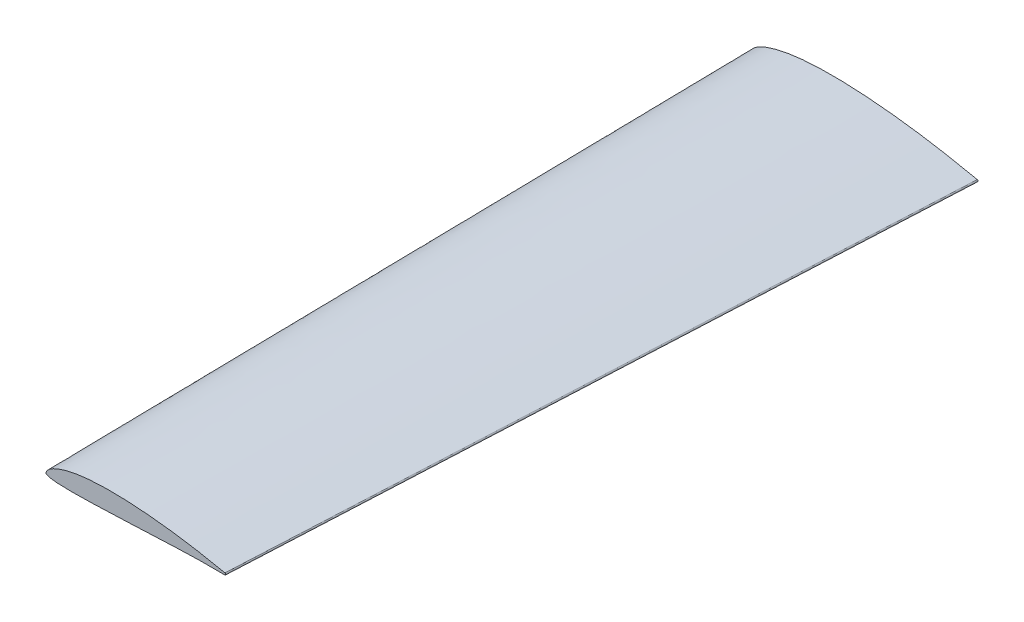
ISO-10303-21;
HEADER;
FILE_DESCRIPTION(('STEP AP214'),'2;1');
FILE_NAME('part.step','',(''),(''),'','','');
FILE_SCHEMA(('AUTOMOTIVE_DESIGN { 1 0 10303 214 1 1 1 1 }'));
ENDSEC;
DATA;
#1=APPLICATION_CONTEXT('core data for automotive mechanical design processes');
#2=APPLICATION_PROTOCOL_DEFINITION('international standard','automotive_design',2000,#1);
#3=PRODUCT_CONTEXT('',#1,'mechanical');
#4=PRODUCT('Part','Part','',(#3));
#5=PRODUCT_RELATED_PRODUCT_CATEGORY('part','',(#4));
#6=PRODUCT_DEFINITION_FORMATION('','',#4);
#7=PRODUCT_DEFINITION_CONTEXT('part definition',#1,'design');
#8=PRODUCT_DEFINITION('design','',#6,#7);
#9=PRODUCT_DEFINITION_SHAPE('','',#8);
#10=(LENGTH_UNIT() NAMED_UNIT(*) SI_UNIT(.MILLI.,.METRE.));
#11=(NAMED_UNIT(*) PLANE_ANGLE_UNIT() SI_UNIT($,.RADIAN.));
#12=(NAMED_UNIT(*) SI_UNIT($,.STERADIAN.) SOLID_ANGLE_UNIT());
#13=UNCERTAINTY_MEASURE_WITH_UNIT(LENGTH_MEASURE(1.E-05),#10,'distance_accuracy_value','');
#14=(GEOMETRIC_REPRESENTATION_CONTEXT(3) GLOBAL_UNCERTAINTY_ASSIGNED_CONTEXT((#13)) GLOBAL_UNIT_ASSIGNED_CONTEXT((#10,
#11,#12)) REPRESENTATION_CONTEXT('',''));
#15=CARTESIAN_POINT('',(0.,0.,0.));
#16=DIRECTION('',(0.,0.,1.));
#17=DIRECTION('',(1.,0.,0.));
#18=AXIS2_PLACEMENT_3D('',#15,#16,#17);
#19=CARTESIAN_POINT('',(13.4517460063052,2.2360292141561,740.));
#20=DIRECTION('',(0.,0.,1.));
#21=DIRECTION('',(1.,0.,0.));
#22=AXIS2_PLACEMENT_3D('',#19,#20,#21);
#23=PLANE('',#22);
#24=CARTESIAN_POINT('',(197.291595349815,2.86793277946552,740.));
#25=CARTESIAN_POINT('',(195.312079724609,3.27334955577674,740.));
#26=CARTESIAN_POINT('',(191.074144591571,4.14627716334438,740.));
#27=CARTESIAN_POINT('',(184.318478618436,5.51626997247974,740.));
#28=CARTESIAN_POINT('',(176.837510223753,6.97176864434472,740.));
#29=CARTESIAN_POINT('',(168.752566914659,8.44637887681676,740.));
#30=CARTESIAN_POINT('',(160.147793554918,9.89426193294475,740.));
#31=CARTESIAN_POINT('',(151.105981215813,11.2786216238562,740.));
#32=CARTESIAN_POINT('',(141.718962801258,12.5746341173652,740.));
#33=CARTESIAN_POINT('',(132.082268781343,13.7529127900567,740.));
#34=CARTESIAN_POINT('',(122.295761881316,14.7919564135995,740.));
#35=CARTESIAN_POINT('',(112.458756480771,15.6615781652495,740.));
#36=CARTESIAN_POINT('',(102.670664042973,16.3387879453908,740.));
#37=CARTESIAN_POINT('',(93.0280749944796,16.8041132858275,740.));
#38=CARTESIAN_POINT('',(83.6221091385133,17.0383550287883,740.));
#39=CARTESIAN_POINT('',(74.5400080228458,17.0313313584405,740.));
#40=CARTESIAN_POINT('',(65.8641711325625,16.7717363131863,740.));
#41=CARTESIAN_POINT('',(57.6703172483418,16.2564676927047,740.));
#42=CARTESIAN_POINT('',(50.0236676445992,15.4847749300983,740.));
#43=CARTESIAN_POINT('',(42.9821543791823,14.4513259051911,740.));
#44=CARTESIAN_POINT('',(36.5929817590931,13.2019314567816,740.));
#45=CARTESIAN_POINT('',(30.8984099214197,11.7419931500888,740.));
#46=CARTESIAN_POINT('',(25.93615424469,10.0880791762876,740.));
#47=CARTESIAN_POINT('',(21.7230729086209,8.31360903600298,740.));
#48=CARTESIAN_POINT('',(18.2789002988487,6.46559766044276,740.));
#49=CARTESIAN_POINT('',(15.62819772296,4.62389921968104,740.));
#50=CARTESIAN_POINT('',(13.7592710907508,2.78465935760903,740.));
#51=CARTESIAN_POINT('',(12.7413729914095,1.1678335658997,740.));
#52=CARTESIAN_POINT('',(12.3072927928413,-0.549235551179624,740.));
#53=CARTESIAN_POINT('',(13.8612768515086,-1.69864203566333,740.));
#54=CARTESIAN_POINT('',(16.101807562113,-2.27520943388668,740.));
#55=CARTESIAN_POINT('',(19.4492611671672,-2.91777390324169,740.));
#56=CARTESIAN_POINT('',(23.8087875319364,-3.32636967555989,740.));
#57=CARTESIAN_POINT('',(29.1783989314235,-3.61916373660292,740.));
#58=CARTESIAN_POINT('',(35.5023561922327,-3.7507043040599,740.));
#59=CARTESIAN_POINT('',(42.7238269652506,-3.75126757238169,740.));
#60=CARTESIAN_POINT('',(50.7702678647919,-3.6304211165848,740.));
#61=CARTESIAN_POINT('',(59.5562442179012,-3.40154041694244,740.));
#62=CARTESIAN_POINT('',(68.9854342669128,-3.09488549846827,740.));
#63=CARTESIAN_POINT('',(78.9480811467622,-2.72722728644086,740.));
#64=CARTESIAN_POINT('',(89.3285085947018,-2.30347692773391,740.));
#65=CARTESIAN_POINT('',(100.00979181249,-1.8451067250394,740.));
#66=CARTESIAN_POINT('',(110.872783341423,-1.35588828422285,740.));
#67=CARTESIAN_POINT('',(121.797709464549,-0.858911186436468,740.));
#68=CARTESIAN_POINT('',(132.659294998299,-0.37673803821542,740.));
#69=CARTESIAN_POINT('',(143.329256663084,0.0612424511785985,740.));
#70=CARTESIAN_POINT('',(153.676942484987,0.453434481292482,740.));
#71=CARTESIAN_POINT('',(163.572760876274,0.766125592478284,740.));
#72=CARTESIAN_POINT('',(172.88752896712,0.98246672953275,740.));
#73=CARTESIAN_POINT('',(181.486359534792,1.08670782635015,740.));
#74=CARTESIAN_POINT('',(189.245531160731,1.07766316980782,740.));
#75=CARTESIAN_POINT('',(194.316954018626,0.97904099962605,740.));
#76=CARTESIAN_POINT('',(196.811210155025,0.903211349424589,740.));
#77=CARTESIAN_POINT('',(197.024916702042,0.896515167352307,740.));
#78=B_SPLINE_CURVE_WITH_KNOTS('',3,(#24,#25,#26,#27,#28,#29,#30,#31,#32,#33,#34,#35,#36,#37,#38,
#39,#40,#41,#42,#43,#44,#45,#46,#47,#48,#49,#50,#51,#52,#53,#54,#55,#56,#57,#58,#59,#60,#61,#62,
#63,#64,#65,#66,#67,#68,#69,#70,#71,#72,#73,#74,#75,#76,#77),.UNSPECIFIED.,.F.,.F.,(4,1,1,1,1,1,
1,1,1,1,1,1,1,1,1,1,1,1,1,1,1,1,1,1,1,1,1,1,1,1,1,1,1,1,1,1,1,1,1,1,1,1,1,1,1,1,1,1,1,1,1,4),
(0.0380283592532992,0.0528763216078135,0.0699963828754541,0.0888022218683958,0.109061098247873,
0.130567425061989,0.153116971173523,0.176480775419818,0.200411415680187,0.22467357352927,
0.249017674403552,0.273197099739573,0.296987794138895,0.320168615199728,0.342541608750088,
0.363922282890659,0.384135181751947,0.403044445551104,0.42055410189389,0.436574577540293,
0.451009032189176,0.463855249744138,0.47509187234383,0.484672624467163,0.492592722285496,
0.49887863981433,0.503680966723728,0.506999829484217,0.510377645818406,0.516186564755205,
0.52448436696778,0.535271809634217,0.548506368525426,0.564092689522407,0.581895750586396,
0.601730211376006,0.623407354724284,0.646676813485776,0.671267833399773,0.696890216729438,
0.723252935121691,0.750070310983007,0.777040747125043,0.803862160527172,0.830208088720891,
0.855753570413101,0.880187506036329,0.90318552328119,0.924424801622873,0.943584131987353,
0.960334021796242,0.961903264898922),.UNSPECIFIED.);
#79=CARTESIAN_POINT('',(197.291595349815,2.86793277946552,740.));
#80=VERTEX_POINT('',#79);
#81=CARTESIAN_POINT('',(197.024916702042,0.89651516735231,740.));
#82=VERTEX_POINT('',#81);
#83=EDGE_CURVE('E132',#80,#82,#78,.T.);
#84=ORIENTED_EDGE('',*,*,#83,.T.);
#85=CARTESIAN_POINT('',(197.056234870489,1.89602463320301,740.));
#86=DIRECTION('',(0.,0.,-1.));
#87=DIRECTION('',(-1.,0.,0.));
#88=AXIS2_PLACEMENT_3D('',#85,#86,#87);
#89=CIRCLE('',#88,0.999999999999998);
#90=EDGE_CURVE('E13',#80,#82,#89,.T.);
#91=ORIENTED_EDGE('',*,*,#90,.F.);
#92=EDGE_LOOP('',(#84,#91));
#93=FACE_BOUND('',#92,.T.);
#94=ADVANCED_FACE('F122',(#93),#23,.T.);
#95=CARTESIAN_POINT('',(233.846004199116,1.9809981067497,0.));
#96=DIRECTION('',(0.,0.,-1.));
#97=DIRECTION('',(-1.,0.,0.));
#98=AXIS2_PLACEMENT_3D('',#95,#96,#97);
#99=PLANE('',#98);
#100=CARTESIAN_POINT('',(122.5,8.27788481283642,0.));
#101=DIRECTION('',(0.,0.,-1.));
#102=DIRECTION('',(-1.,0.,0.));
#103=AXIS2_PLACEMENT_3D('',#100,#101,#102);
#104=CIRCLE('',#103,4.);
#105=CARTESIAN_POINT('',(118.5,8.27788481283642,0.));
#106=VERTEX_POINT('',#105);
#107=EDGE_CURVE('E330',#106,#106,#104,.F.);
#108=ORIENTED_EDGE('',*,*,#107,.T.);
#109=EDGE_LOOP('',(#108));
#110=FACE_BOUND('',#109,.T.);
#111=CARTESIAN_POINT('',(62.5,8.27788481283643,0.));
#112=DIRECTION('',(0.,0.,-1.));
#113=DIRECTION('',(-1.,0.,0.));
#114=AXIS2_PLACEMENT_3D('',#111,#112,#113);
#115=CIRCLE('',#114,6.00000000000001);
#116=CARTESIAN_POINT('',(56.5,8.27788481283643,0.));
#117=VERTEX_POINT('',#116);
#118=EDGE_CURVE('E168',#117,#117,#115,.F.);
#119=ORIENTED_EDGE('',*,*,#118,.T.);
#120=EDGE_LOOP('',(#119));
#121=FACE_BOUND('',#120,.T.);
#122=CARTESIAN_POINT('',(233.846004199116,1.9809981067497,0.));
#123=DIRECTION('',(0.,0.,-1.));
#124=DIRECTION('',(-1.,0.,0.));
#125=AXIS2_PLACEMENT_3D('',#122,#123,#124);
#126=CIRCLE('',#125,1.);
#127=CARTESIAN_POINT('',(234.045372190915,2.96092279969609,0.));
#128=VERTEX_POINT('',#127);
#129=CARTESIAN_POINT('',(234.045372190915,1.0010734138033,0.));
#130=VERTEX_POINT('',#129);
#131=EDGE_CURVE('E156',#128,#130,#126,.T.);
#132=ORIENTED_EDGE('',*,*,#131,.T.);
#133=CARTESIAN_POINT('',(234.045372190915,2.96092279969609,0.));
#134=CARTESIAN_POINT('',(233.084471371881,3.15642034075415,0.));
#135=CARTESIAN_POINT('',(229.58356297286,3.87157090827319,0.));
#136=CARTESIAN_POINT('',(223.274395629888,5.17134515425177,0.));
#137=CARTESIAN_POINT('',(214.773098276905,6.89533747824343,0.));
#138=CARTESIAN_POINT('',(205.421887784745,8.71471082420948,0.));
#139=CARTESIAN_POINT('',(195.315708649586,10.5579736214296,0.));
#140=CARTESIAN_POINT('',(184.559741951098,12.367827448646,0.));
#141=CARTESIAN_POINT('',(173.257476528351,14.0982770697002,0.));
#142=CARTESIAN_POINT('',(161.523703511221,15.7182926942843,0.));
#143=CARTESIAN_POINT('',(149.477835987293,17.1911410430512,0.));
#144=CARTESIAN_POINT('',(137.244702363111,18.4899455805053,0.));
#145=CARTESIAN_POINT('',(124.948445613144,19.5769727781346,0.));
#146=CARTESIAN_POINT('',(112.713330066451,20.4234850113381,0.));
#147=CARTESIAN_POINT('',(100.660093756216,21.0051416947914,0.));
#148=CARTESIAN_POINT('',(88.9026364364503,21.2979438812058,0.));
#149=CARTESIAN_POINT('',(77.5500100418601,21.2891643007189,0.));
#150=CARTESIAN_POINT('',(66.7052139287931,20.9646705012658,0.));
#151=CARTESIAN_POINT('',(56.4628965730948,20.3205847323833,0.));
#152=CARTESIAN_POINT('',(46.9045845677836,19.3559687853959,0.));
#153=CARTESIAN_POINT('',(38.102692985165,18.0641575100364,0.));
#154=CARTESIAN_POINT('',(30.1162272090289,16.5024144547639,0.));
#155=CARTESIAN_POINT('',(22.9980124107399,14.6774915760678,0.));
#156=CARTESIAN_POINT('',(16.7951928134715,12.6100991128857,0.));
#157=CARTESIAN_POINT('',(11.5288411419299,10.3920114409848,0.));
#158=CARTESIAN_POINT('',(7.22362537819931,8.08199722435898,0.));
#159=CARTESIAN_POINT('',(3.91024715682811,5.77987417558057,0.));
#160=CARTESIAN_POINT('',(1.57408886505825,3.48082434952316,0.));
#161=CARTESIAN_POINT('',(0.301716239555787,1.45979211072129,0.));
#162=CARTESIAN_POINT('',(-0.240884010062589,-0.686544285271975,0.));
#163=CARTESIAN_POINT('',(1.70159606232904,-2.12330239215092,0.));
#164=CARTESIAN_POINT('',(4.50225945011166,-2.84401164176749,0.));
#165=CARTESIAN_POINT('',(8.68657645590246,-3.64721723120633,0.));
#166=CARTESIAN_POINT('',(14.1359844115289,-4.15796195017915,0.));
#167=CARTESIAN_POINT('',(20.8479986606477,-4.52395453088632,0.));
#168=CARTESIAN_POINT('',(28.7529452365513,-4.68838024539354,0.));
#169=CARTESIAN_POINT('',(37.7797837028233,-4.68908433671779,0.));
#170=CARTESIAN_POINT('',(47.8378348273489,-4.53802627357021,0.));
#171=CARTESIAN_POINT('',(58.8203052689232,-4.25192540622226,0.));
#172=CARTESIAN_POINT('',(70.6067928304393,-3.86860676586201,0.));
#173=CARTESIAN_POINT('',(83.0601014305525,-3.40903400899768,0.));
#174=CARTESIAN_POINT('',(96.0356357408246,-2.87934606912652,0.));
#175=CARTESIAN_POINT('',(109.387239763436,-2.30638332451764,0.));
#176=CARTESIAN_POINT('',(122.965979175003,-1.69486028240521,0.));
#177=CARTESIAN_POINT('',(136.622136829319,-1.07363891913129,0.));
#178=CARTESIAN_POINT('',(150.199118746901,-0.470922492762087,0.));
#179=CARTESIAN_POINT('',(163.536570828241,0.0765531102304625,0.));
#180=CARTESIAN_POINT('',(176.471178105942,0.566793139387138,0.));
#181=CARTESIAN_POINT('',(188.840951095307,0.957657020254261,0.));
#182=CARTESIAN_POINT('',(200.484411209042,1.22808343393371,0.));
#183=CARTESIAN_POINT('',(211.232949418717,1.35838479790393,0.));
#184=CARTESIAN_POINT('',(220.931913951134,1.34707897086306,0.));
#185=CARTESIAN_POINT('',(228.394859291241,1.20194970224318,0.));
#186=CARTESIAN_POINT('',(232.652829322058,1.05572626400647,0.));
#187=CARTESIAN_POINT('',(234.045372190915,1.0010734138033,0.));
#188=B_SPLINE_CURVE_WITH_KNOTS('',3,(#133,#134,#135,#136,#137,#138,#139,#140,#141,#142,#143,
#144,#145,#146,#147,#148,#149,#150,#151,#152,#153,#154,#155,#156,#157,#158,#159,#160,#161,#162,
#163,#164,#165,#166,#167,#168,#169,#170,#171,#172,#173,#174,#175,#176,#177,#178,#179,#180,#181,
#182,#183,#184,#185,#186,#187),.UNSPECIFIED.,.F.,.F.,(4,1,1,1,1,1,1,1,1,1,1,1,1,1,1,1,1,1,1,1,1,
1,1,1,1,1,1,1,1,1,1,1,1,1,1,1,1,1,1,1,1,1,1,1,1,1,1,1,1,1,1,1,4),(0.0319213311266676,
0.0376873555473671,0.0528763216078136,0.0699963828754541,0.0888022218683957,0.109061098247873,
0.130567425061989,0.153116971173523,0.176480775419818,0.200411415680187,0.22467357352927,
0.249017674403552,0.273197099739573,0.296987794138895,0.320168615199728,0.342541608750088,
0.363922282890659,0.384135181751947,0.403044445551104,0.42055410189389,0.436574577540293,
0.451009032189176,0.463855249744138,0.47509187234383,0.484672624467163,0.492592722285496,
0.49887863981433,0.503680966723728,0.506999829484217,0.510377645818406,0.516186564755205,
0.52448436696778,0.535271809634217,0.548506368525426,0.564092689522407,0.581895750586396,
0.601730211376006,0.623407354724284,0.646676813485776,0.671267833399773,0.696890216729438,
0.723252935121691,0.750070310983006,0.777040747125043,0.803862160527172,0.830208088720891,
0.8557535704131,0.880187506036329,0.90318552328119,0.924424801622873,0.943584131987353,
0.960334021796242,0.968546497754523),.UNSPECIFIED.);
#189=EDGE_CURVE('E152',#128,#130,#188,.T.);
#190=ORIENTED_EDGE('',*,*,#189,.F.);
#191=EDGE_LOOP('',(#132,#190));
#192=FACE_BOUND('',#191,.T.);
#193=ADVANCED_FACE('F155',(#110,#121,#192),#99,.T.);
#194=CARTESIAN_POINT('',(234.045372190915,2.96092279969609,0.));
#195=CARTESIAN_POINT('',(221.794113243882,2.9299261262859,246.666666666667));
#196=CARTESIAN_POINT('',(209.542854296848,2.89892945287571,493.333333333333));
#197=CARTESIAN_POINT('',(197.291595349815,2.86793277946552,740.));
#198=CARTESIAN_POINT('',(229.124217712672,3.96214330092415,0.));
#199=CARTESIAN_POINT('',(217.216652694783,3.86297660124114,246.666666666667));
#200=CARTESIAN_POINT('',(205.309087676894,3.76380990155814,493.333333333333));
#201=CARTESIAN_POINT('',(193.401522659006,3.66464320187513,740.));
#202=CARTESIAN_POINT('',(219.289488668589,6.00446265928543,0.));
#203=CARTESIAN_POINT('',(208.067881015589,5.76025759515323,246.666666666667));
#204=CARTESIAN_POINT('',(196.84627336259,5.51605253102104,493.333333333334));
#205=CARTESIAN_POINT('',(185.62466570959,5.27184746688884,740.000000000001));
#206=CARTESIAN_POINT('',(204.504189842848,8.91417636466468,0.));
#207=CARTESIAN_POINT('',(194.313044592371,8.45433412200639,246.666666666666));
#208=CARTESIAN_POINT('',(184.121899341894,7.99449187934809,493.333333333333));
#209=CARTESIAN_POINT('',(173.930754091417,7.5346496366898,739.999999999999));
#210=CARTESIAN_POINT('',(189.666116251643,11.5525186424466,0.));
#211=CARTESIAN_POINT('',(180.509967684622,10.8944810875847,246.666666666667));
#212=CARTESIAN_POINT('',(171.353819117602,10.2364435327227,493.333333333334));
#213=CARTESIAN_POINT('',(162.197670550581,9.57840597786068,740.000000000001));
#214=CARTESIAN_POINT('',(174.777122160643,13.895515577838,0.));
#215=CARTESIAN_POINT('',(166.660741967789,13.0609226749031,246.666666666666));
#216=CARTESIAN_POINT('',(158.544361774934,12.2263297719683,493.333333333333));
#217=CARTESIAN_POINT('',(150.42798158208,11.3917368690334,739.999999999999));
#218=CARTESIAN_POINT('',(159.844517179017,15.9522388161574,0.));
#219=CARTESIAN_POINT('',(152.772083493218,14.9621749701634,246.666666666666));
#220=CARTESIAN_POINT('',(145.699649807419,13.9721111241694,493.333333333333));
#221=CARTESIAN_POINT('',(138.62721612162,12.9820472781754,739.999999999999));
#222=CARTESIAN_POINT('',(144.873762507699,17.720826017515,0.));
#223=CARTESIAN_POINT('',(138.848907734873,16.5961358115269,246.666666666667));
#224=CARTESIAN_POINT('',(132.824052962048,15.4714456055389,493.333333333335));
#225=CARTESIAN_POINT('',(126.799198189222,14.3467553995508,740.000000000002));
#226=CARTESIAN_POINT('',(129.869167960459,19.188185322164,0.));
#227=CARTESIAN_POINT('',(124.895090272903,17.9498130708675,246.666666666666));
#228=CARTESIAN_POINT('',(119.921012585347,16.7114408195711,493.333333333332));
#229=CARTESIAN_POINT('',(114.946934897791,15.4730685682746,739.999999999998));
#230=CARTESIAN_POINT('',(114.833953223789,20.3158295790169,0.));
#231=CARTESIAN_POINT('',(110.913597498735,18.9875537616487,246.666666666667));
#232=CARTESIAN_POINT('',(106.99324177368,17.6592779442804,493.333333333334));
#233=CARTESIAN_POINT('',(103.072886048625,16.3310021269122,740.000000000001));
#234=CARTESIAN_POINT('',(102.28385720302,20.9401547563009,0.));
#235=CARTESIAN_POINT('',(99.2437073493346,19.5589200578988,246.666666666666));
#236=CARTESIAN_POINT('',(96.2035574956495,18.1776853594967,493.333333333332));
#237=CARTESIAN_POINT('',(93.1634076419644,16.7964506610946,739.999999999998));
#238=CARTESIAN_POINT('',(92.235287250945,21.2159276013156,0.));
#239=CARTESIAN_POINT('',(89.9002759060238,19.8077930946634,246.666666666667));
#240=CARTESIAN_POINT('',(87.5652645611026,18.3996585880111,493.333333333335));
#241=CARTESIAN_POINT('',(85.2302532161814,16.9915240813589,740.000000000002));
#242=CARTESIAN_POINT('',(84.6963374503799,21.3016410145387,0.));
#243=CARTESIAN_POINT('',(82.8905596492283,19.8818433678788,246.666666666666));
#244=CARTESIAN_POINT('',(81.0847818480766,18.4620457212189,493.333333333332));
#245=CARTESIAN_POINT('',(79.279004046925,17.042248074559,739.999999999998));
#246=CARTESIAN_POINT('',(77.1567511942151,21.2538798701553,0.));
#247=CARTESIAN_POINT('',(75.8804480537026,19.8315679684863,246.666666666667));
#248=CARTESIAN_POINT('',(74.6041449131902,18.4092560668173,493.333333333334));
#249=CARTESIAN_POINT('',(73.3278417726777,16.9869441651482,740.000000000001));
#250=CARTESIAN_POINT('',(69.6193700884628,21.0563611406712,0.));
#251=CARTESIAN_POINT('',(68.8726051366837,19.6419544320953,246.666666666666));
#252=CARTESIAN_POINT('',(68.1258401849045,18.2275477235194,493.333333333333));
#253=CARTESIAN_POINT('',(67.3790752331254,16.8131410149435,739.999999999999));
#254=CARTESIAN_POINT('',(62.0879566014935,20.6908789768065,0.));
#255=CARTESIAN_POINT('',(61.8705322909847,19.2959933156077,246.666666666667));
#256=CARTESIAN_POINT('',(61.6531079804759,17.9011076544088,493.333333333334));
#257=CARTESIAN_POINT('',(61.4356836699672,16.5062219932099,740.000000000001));
#258=CARTESIAN_POINT('',(54.5680163984297,20.133542612521,0.));
#259=CARTESIAN_POINT('',(54.8793852104563,18.7715170887923,246.666666666666));
#260=CARTESIAN_POINT('',(55.190754022483,17.4094915650635,493.333333333333));
#261=CARTESIAN_POINT('',(55.5021228345097,16.0474660413348,739.999999999999));
#262=CARTESIAN_POINT('',(47.0675485653049,19.3520974879042,0.));
#263=CARTESIAN_POINT('',(47.9066320041519,18.0382148888877,246.666666666667));
#264=CARTESIAN_POINT('',(48.7457154429989,16.7243322898712,493.333333333334));
#265=CARTESIAN_POINT('',(49.5847988818459,15.4104496908548,740.000000000001));
#266=CARTESIAN_POINT('',(40.8447167472665,18.4726988704588,0.));
#267=CARTESIAN_POINT('',(42.1219485825726,17.2148449702194,246.666666666667));
#268=CARTESIAN_POINT('',(43.3991804178787,15.9569910699799,493.333333333333));
#269=CARTESIAN_POINT('',(44.6764122531848,14.6991371697405,740.));
#270=CARTESIAN_POINT('',(35.8908061290404,17.6178600571998,0.));
#271=CARTESIAN_POINT('',(37.5168963699704,16.4159041431136,246.666666666667));
#272=CARTESIAN_POINT('',(39.1429866109004,15.2139482290273,493.333333333333));
#273=CARTESIAN_POINT('',(40.7690768518304,14.011992314941,740.));
#274=CARTESIAN_POINT('',(32.1906877466803,16.8932331544261,0.));
#275=CARTESIAN_POINT('',(34.07756508815,15.7386483351364,246.666666666667));
#276=CARTESIAN_POINT('',(35.9644424296197,14.5840635158466,493.333333333333));
#277=CARTESIAN_POINT('',(37.8513197710893,13.4294786965569,740.));
#278=CARTESIAN_POINT('',(28.5105236951635,16.0725996667549,0.));
#279=CARTESIAN_POINT('',(30.6568040234792,14.9723006253558,246.666666666667));
#280=CARTESIAN_POINT('',(32.8030843517948,13.8720015839567,493.333333333333));
#281=CARTESIAN_POINT('',(34.9493646801105,12.7717025425577,740.));
#282=CARTESIAN_POINT('',(24.8564349397307,15.1422590467274,0.));
#283=CARTESIAN_POINT('',(27.260529838683,14.1036114865409,246.666666666667));
#284=CARTESIAN_POINT('',(29.6646247376354,13.0649639263544,493.333333333334));
#285=CARTESIAN_POINT('',(32.0687196365877,12.0263163661679,740.000000000001));
#286=CARTESIAN_POINT('',(21.237305525474,14.0830755436894,0.));
#287=CARTESIAN_POINT('',(23.8968877077042,13.1151721414945,246.666666666667));
#288=CARTESIAN_POINT('',(26.5564698899344,12.1472687392997,493.333333333333));
#289=CARTESIAN_POINT('',(29.2160520721646,11.1793653371049,740.));
#290=CARTESIAN_POINT('',(17.6641802256163,12.8774023558106,0.));
#291=CARTESIAN_POINT('',(20.5761716109823,11.9906290721755,246.666666666667));
#292=CARTESIAN_POINT('',(23.4881629963483,11.1038557885405,493.333333333334));
#293=CARTESIAN_POINT('',(26.4001543817143,10.2170825049054,740.));
#294=CARTESIAN_POINT('',(14.7347734185467,11.7389076168553,0.));
#295=CARTESIAN_POINT('',(17.8537992678466,10.9293460956912,246.666666666667));
#296=CARTESIAN_POINT('',(20.9728251171465,10.1197845745271,493.333333333334));
#297=CARTESIAN_POINT('',(24.0918509664465,9.31022305336293,740.000000000001));
#298=CARTESIAN_POINT('',(12.4314177567035,10.7319662172645,0.));
#299=CARTESIAN_POINT('',(15.7134138974972,9.9908108308343,246.666666666666));
#300=CARTESIAN_POINT('',(18.995410038291,9.24965544440409,493.333333333333));
#301=CARTESIAN_POINT('',(22.2774061790847,8.50850005797388,739.999999999999));
#302=CARTESIAN_POINT('',(10.7286429961644,9.9225469567882,0.));
#303=CARTESIAN_POINT('',(14.1311516778584,9.23660874912249,246.666666666667));
#304=CARTESIAN_POINT('',(17.5336603595524,8.55067054145678,493.333333333334));
#305=CARTESIAN_POINT('',(20.9361690412464,7.86473233379108,740.000000000001));
#306=CARTESIAN_POINT('',(9.05479876366669,9.05455630166904,0.));
#307=CARTESIAN_POINT('',(12.5758972062479,8.42788204538471,246.666666666666));
#308=CARTESIAN_POINT('',(16.096995648829,7.80120778910037,493.333333333333));
#309=CARTESIAN_POINT('',(19.6180940914102,7.17453353281603,739.999999999999));
#310=CARTESIAN_POINT('',(7.4186820914979,8.11726419274678,0.));
#311=CARTESIAN_POINT('',(11.0557604027988,7.55482609866555,246.666666666667));
#312=CARTESIAN_POINT('',(14.6928387140996,6.99238800458432,493.333333333333));
#313=CARTESIAN_POINT('',(18.3299170254005,6.4299499105031,740.));
#314=CARTESIAN_POINT('',(5.82711746158076,7.10576804768862,0.));
#315=CARTESIAN_POINT('',(9.57714221382747,6.61278631141867,246.666666666667));
#316=CARTESIAN_POINT('',(13.3271669660742,6.11980457514873,493.333333333333));
#317=CARTESIAN_POINT('',(17.0771917183209,5.62682283887878,740.));
#318=CARTESIAN_POINT('',(4.55587480996735,6.18102180044649,0.));
#319=CARTESIAN_POINT('',(8.3964054049417,5.75149964651408,246.666666666666));
#320=CARTESIAN_POINT('',(12.2369359999161,5.32197749258167,493.333333333333));
#321=CARTESIAN_POINT('',(16.0774665948904,4.89245533864927,739.999999999999));
#322=CARTESIAN_POINT('',(3.5867143571928,5.38034497942647,0.));
#323=CARTESIAN_POINT('',(7.49629854884602,5.00601878575468,246.666666666667));
#324=CARTESIAN_POINT('',(11.4058827404992,4.63169259208288,493.333333333334));
#325=CARTESIAN_POINT('',(15.3154669321525,4.25736639841109,740.000000000001));
#326=CARTESIAN_POINT('',(2.8878970503571,4.74736857183619,0.));
#327=CARTESIAN_POINT('',(6.84734805614401,4.41673716853867,246.666666666667));
#328=CARTESIAN_POINT('',(10.8067990619309,4.08610576524114,493.333333333333));
#329=CARTESIAN_POINT('',(14.7662500677178,3.75547436194362,740.));
#330=CARTESIAN_POINT('',(2.22427170138093,4.0775313910847,0.));
#331=CARTESIAN_POINT('',(6.23118229709822,3.79319757459415,246.666666666667));
#332=CARTESIAN_POINT('',(10.2380928928155,3.50886375810359,493.333333333333));
#333=CARTESIAN_POINT('',(14.2450034885328,3.22452994161304,740.));
#334=CARTESIAN_POINT('',(1.60563594314412,3.3652700022986,0.));
#335=CARTESIAN_POINT('',(5.6568264193525,3.13034201693223,246.666666666667));
#336=CARTESIAN_POINT('',(9.70801689556087,2.89541403156586,493.333333333333));
#337=CARTESIAN_POINT('',(13.7592073717692,2.66048604619949,740.));
#338=CARTESIAN_POINT('',(1.04180385726185,2.6095102189365,0.));
#339=CARTESIAN_POINT('',(5.13348719688817,2.42708631341766,246.666666666667));
#340=CARTESIAN_POINT('',(9.22517053651448,2.24466240789882,493.333333333333));
#341=CARTESIAN_POINT('',(13.3168538761408,2.06223850237998,740.));
#342=CARTESIAN_POINT('',(0.562909267374019,1.79414922417329,0.));
#343=CARTESIAN_POINT('',(4.68921649286999,1.66844719855819,246.666666666667));
#344=CARTESIAN_POINT('',(8.81552371836596,1.54274517294308,493.333333333334));
#345=CARTESIAN_POINT('',(12.9418309438619,1.41704314732798,740.));
#346=CARTESIAN_POINT('',(0.193652953403498,0.92755892740975,0.));
#347=CARTESIAN_POINT('',(4.34642818744044,0.862638406533515,246.666666666667));
#348=CARTESIAN_POINT('',(8.49920342147738,0.797717885657279,493.333333333333));
#349=CARTESIAN_POINT('',(12.6519786555143,0.732797364781044,740.));
#350=CARTESIAN_POINT('',(0.0318424753081781,0.313216277061952,0.));
#351=CARTESIAN_POINT('',(4.19638166709598,0.29139175691789,246.666666666667));
#352=CARTESIAN_POINT('',(8.36092085888377,0.269567236773827,493.333333333333));
#353=CARTESIAN_POINT('',(12.5254600506716,0.247742716629765,740.));
#354=CARTESIAN_POINT('',(0.0199937833034883,-0.000753236264200462,0.));
#355=CARTESIAN_POINT('',(4.18533516441636,-0.000501798028216508,246.666666666667));
#356=CARTESIAN_POINT('',(8.35067654552923,-0.000250359792232553,493.333333333333));
#357=CARTESIAN_POINT('',(12.5160179266421,1.07844375138823E-06,740.));
#358=CARTESIAN_POINT('',(0.0142152575959383,-0.153874011403267,0.));
#359=CARTESIAN_POINT('',(4.17994786093278,-0.142856279894793,246.666666666667));
#360=CARTESIAN_POINT('',(8.34568046426963,-0.131838548386318,493.333333333333));
#361=CARTESIAN_POINT('',(12.5114130676065,-0.120820816877844,740.));
#362=CARTESIAN_POINT('',(0.0359673568880309,-0.464039093319274,0.));
#363=CARTESIAN_POINT('',(4.20000320752688,-0.431190535425803,246.666666666666));
#364=CARTESIAN_POINT('',(8.36403905816573,-0.398341977532332,493.333333333333));
#365=CARTESIAN_POINT('',(12.5280749088046,-0.365493419638861,739.999999999999));
#366=CARTESIAN_POINT('',(0.237724211731499,-0.885517884327524,0.));
#367=CARTESIAN_POINT('',(4.38655035257089,-0.823458616982183,246.666666666667));
#368=CARTESIAN_POINT('',(8.53537649341029,-0.761399349636841,493.333333333334));
#369=CARTESIAN_POINT('',(12.6842026342497,-0.6993400822915,740.000000000001));
#370=CARTESIAN_POINT('',(0.551681322370607,-1.22548061071557,0.));
#371=CARTESIAN_POINT('',(4.67772362539405,-1.14021408291504,246.666666666666));
#372=CARTESIAN_POINT('',(8.80376592841749,-1.0549475551145,493.333333333333));
#373=CARTESIAN_POINT('',(12.9298082314409,-0.969681027313965,739.999999999999));
#374=CARTESIAN_POINT('',(0.915639378563885,-1.5073957730364,0.));
#375=CARTESIAN_POINT('',(5.01557893957047,-1.40296678521357,246.666666666667));
#376=CARTESIAN_POINT('',(9.11551850057705,-1.29853779739074,493.333333333334));
#377=CARTESIAN_POINT('',(13.2154580615836,-1.19410880956791,740.000000000001));
#378=CARTESIAN_POINT('',(1.30891527451758,-1.74658849655118,0.));
#379=CARTESIAN_POINT('',(5.38084923727801,-1.62590281208278,246.666666666666));
#380=CARTESIAN_POINT('',(9.45278320003844,-1.50521712761439,493.333333333333));
#381=CARTESIAN_POINT('',(13.5247171627989,-1.38453144314599,739.999999999999));
#382=CARTESIAN_POINT('',(1.85317855770432,-2.02898626604004,0.));
#383=CARTESIAN_POINT('',(5.88645086631643,-1.88916418760633,246.666666666667));
#384=CARTESIAN_POINT('',(9.91972317492854,-1.74934210917262,493.333333333334));
#385=CARTESIAN_POINT('',(13.9529954835407,-1.60952003073891,740.000000000001));
#386=CARTESIAN_POINT('',(2.56619239830922,-2.313643727262,0.));
#387=CARTESIAN_POINT('',(6.54886484139292,-2.15490724110727,246.666666666666));
#388=CARTESIAN_POINT('',(10.5315372844766,-1.99617075495253,493.333333333333));
#389=CARTESIAN_POINT('',(14.5142097275603,-1.83743426879779,739.999999999999));
#390=CARTESIAN_POINT('',(3.45087243918399,-2.56615594789257,0.));
#391=CARTESIAN_POINT('',(7.37096165768562,-2.39091432969721,246.666666666667));
#392=CARTESIAN_POINT('',(11.2910508761872,-2.21567271150185,493.333333333334));
#393=CARTESIAN_POINT('',(15.2111400946889,-2.04043109330649,740.000000000001));
#394=CARTESIAN_POINT('',(4.34688207034917,-2.772877952523,0.));
#395=CARTESIAN_POINT('',(8.20382972399394,-2.58354678890648,246.666666666667));
#396=CARTESIAN_POINT('',(12.0607773776387,-2.39421562528995,493.333333333334));
#397=CARTESIAN_POINT('',(15.9177250312835,-2.20488446167343,740.000000000001));
#398=CARTESIAN_POINT('',(5.24523779360061,-2.96874344983617,0.));
#399=CARTESIAN_POINT('',(9.0389112781235,-2.76590892546059,246.666666666666));
#400=CARTESIAN_POINT('',(12.8325847626464,-2.563074401085,493.333333333332));
#401=CARTESIAN_POINT('',(16.6262582471693,-2.36023987670942,739.999999999998));
#402=CARTESIAN_POINT('',(6.14706342725053,-3.14838189721164,0.));
#403=CARTESIAN_POINT('',(9.87718416780124,-2.93334415492068,246.666666666667));
#404=CARTESIAN_POINT('',(13.607304908352,-2.71830641262973,493.333333333335));
#405=CARTESIAN_POINT('',(17.3374256489027,-2.50326867033877,740.000000000002));
#406=CARTESIAN_POINT('',(7.05161657644451,-3.31356226461709,0.));
#407=CARTESIAN_POINT('',(10.7179884836224,-3.08736413751111,246.666666666666));
#408=CARTESIAN_POINT('',(14.3843603908003,-2.86116601040512,493.333333333333));
#409=CARTESIAN_POINT('',(18.0507322979782,-2.63496788329913,739.999999999999));
#410=CARTESIAN_POINT('',(7.95897047661617,-3.46288988461933,0.));
#411=CARTESIAN_POINT('',(11.5613824774374,-3.22673148489657,246.666666666666));
#412=CARTESIAN_POINT('',(15.1637944782587,-2.99057308517382,493.333333333333));
#413=CARTESIAN_POINT('',(18.7662064790799,-2.75441468545107,739.999999999999));
#414=CARTESIAN_POINT('',(8.86884868655473,-3.5959273601195,0.));
#415=CARTESIAN_POINT('',(12.4071139659396,-3.35104323541834,246.666666666667));
#416=CARTESIAN_POINT('',(15.9453792453244,-3.10615911071717,493.333333333334));
#417=CARTESIAN_POINT('',(19.4836445247093,-2.861274986016,740.000000000001));
#418=CARTESIAN_POINT('',(9.7808955592345,-3.71336727108399,0.));
#419=CARTESIAN_POINT('',(13.2548689802484,-3.46081803538006,246.666666666667));
#420=CARTESIAN_POINT('',(16.7288424012624,-3.20826879967613,493.333333333333));
#421=CARTESIAN_POINT('',(20.2028158222763,-2.9557195639722,740.));
#422=CARTESIAN_POINT('',(10.6945678885811,-3.81730622605102,0.));
#423=CARTESIAN_POINT('',(14.1041387864711,-3.55803822522462,246.666666666667));
#424=CARTESIAN_POINT('',(17.513709684361,-3.29877022439822,493.333333333333));
#425=CARTESIAN_POINT('',(20.923280582251,-3.03950222357181,740.));
#426=CARTESIAN_POINT('',(11.9144980932842,-3.94037800592294,0.));
#427=CARTESIAN_POINT('',(15.238087374854,-3.67316463009611,246.666666666667));
#428=CARTESIAN_POINT('',(18.5616766564237,-3.40595125426928,493.333333333334));
#429=CARTESIAN_POINT('',(21.8852659379934,-3.13873787844244,740.));
#430=CARTESIAN_POINT('',(13.4417560521711,-4.06934189292102,0.));
#431=CARTESIAN_POINT('',(16.657715788385,-3.79378047884369,246.666666666667));
#432=CARTESIAN_POINT('',(19.873675524599,-3.51821906476636,493.333333333334));
#433=CARTESIAN_POINT('',(23.0896352608129,-3.24265765068903,740.));
#434=CARTESIAN_POINT('',(15.276281865654,-4.20106557488753,0.));
#435=CARTESIAN_POINT('',(18.3629613617094,-3.91683048661227,246.666666666667));
#436=CARTESIAN_POINT('',(21.4496408577647,-3.63259539833702,493.333333333333));
#437=CARTESIAN_POINT('',(24.5363203538201,-3.34836031006176,740.));
#438=CARTESIAN_POINT('',(17.1121720361553,-4.31303914120166,0.));
#439=CARTESIAN_POINT('',(20.0694483448689,-4.02161584374038,246.666666666667));
#440=CARTESIAN_POINT('',(23.0267246535826,-3.7301925462791,493.333333333333));
#441=CARTESIAN_POINT('',(25.9840009622962,-3.43876924881783,740.));
#442=CARTESIAN_POINT('',(18.949148135561,-4.40637490509989,0.));
#443=CARTESIAN_POINT('',(21.7769273764237,-4.10905066750999,246.666666666667));
#444=CARTESIAN_POINT('',(24.6047066172863,-3.8117264299201,493.333333333334));
#445=CARTESIAN_POINT('',(27.4324858581489,-3.5144021923302,740.));
#446=CARTESIAN_POINT('',(20.7869443295675,-4.48294284133713,0.));
#447=CARTESIAN_POINT('',(23.4851486750182,-4.18092031537875,246.666666666666));
#448=CARTESIAN_POINT('',(26.1833530204689,-3.87889778942037,493.333333333333));
#449=CARTESIAN_POINT('',(28.8815573659195,-3.57687526346199,739.999999999999));
#450=CARTESIAN_POINT('',(22.6253574095946,-4.54425162617185,0.));
#451=CARTESIAN_POINT('',(25.1939247255943,-4.23856615262723,246.666666666666));
#452=CARTESIAN_POINT('',(27.7624920415941,-3.93288067908261,493.333333333333));
#453=CARTESIAN_POINT('',(30.3310593575939,-3.62719520553799,739.999999999999));
#454=CARTESIAN_POINT('',(24.4642141527915,-4.59203076031432,0.));
#455=CARTESIAN_POINT('',(26.9030955490661,-4.28363922229777,246.666666666667));
#456=CARTESIAN_POINT('',(29.3419769453408,-3.97524768428122,493.333333333334));
#457=CARTESIAN_POINT('',(31.7808583416154,-3.66685614626467,740.000000000001));
#458=CARTESIAN_POINT('',(26.3033831411715,-4.62797843238423,0.));
#459=CARTESIAN_POINT('',(28.61253631686,-4.31763601914623,246.666666666667));
#460=CARTESIAN_POINT('',(30.9216894925484,-4.00729360590823,493.333333333333));
#461=CARTESIAN_POINT('',(33.2308426682368,-3.69695119267023,740.));
#462=CARTESIAN_POINT('',(28.7558915960728,-4.6622850033652,0.));
#463=CARTESIAN_POINT('',(30.8920312402584,-4.35025898411192,246.666666666666));
#464=CARTESIAN_POINT('',(33.0281708844441,-4.03823296485863,493.333333333333));
#465=CARTESIAN_POINT('',(35.1643105286296,-3.72620694560535,739.999999999999));
#466=CARTESIAN_POINT('',(31.8218737863967,-4.68427218084544,0.));
#467=CARTESIAN_POINT('',(33.7416708045934,-4.37148985858224,246.666666666667));
#468=CARTESIAN_POINT('',(35.66146782279,-4.05870753631905,493.333333333335));
#469=CARTESIAN_POINT('',(37.5812648409866,-3.74592521405585,740.000000000002));
#470=CARTESIAN_POINT('',(35.5012952806348,-4.68203508209456,0.));
#471=CARTESIAN_POINT('',(37.1613882733993,-4.37037785707011,246.666666666666));
#472=CARTESIAN_POINT('',(38.8214812661638,-4.05872063204566,493.333333333332));
#473=CARTESIAN_POINT('',(40.4815742589283,-3.74706340702121,739.999999999998));
#474=CARTESIAN_POINT('',(39.1807714029445,-4.65612656472165,0.));
#475=CARTESIAN_POINT('',(40.5810819666255,-4.34714229155265,246.666666666667));
#476=CARTESIAN_POINT('',(41.9813925303064,-4.03815801838365,493.333333333334));
#477=CARTESIAN_POINT('',(43.3817030939874,-3.72917374521464,740.000000000001));
#478=CARTESIAN_POINT('',(42.8601908532669,-4.61031348577489,0.));
#479=CARTESIAN_POINT('',(44.0006528609677,-4.30539370290108,246.666666666666));
#480=CARTESIAN_POINT('',(45.1411148686686,-4.00047392002727,493.333333333333));
#481=CARTESIAN_POINT('',(46.2815768763695,-3.69555413715346,739.999999999999));
#482=CARTESIAN_POINT('',(46.5394797110927,-4.54694215211841,0.));
#483=CARTESIAN_POINT('',(47.4200360519736,-4.24727412495219,246.666666666667));
#484=CARTESIAN_POINT('',(48.3005923928545,-3.94760609778597,493.333333333334));
#485=CARTESIAN_POINT('',(49.1811487337354,-3.64793807061976,740.000000000001));
#486=CARTESIAN_POINT('',(50.2186038123835,-4.46878485759634,0.));
#487=CARTESIAN_POINT('',(50.8392031569034,-4.17534208460682,246.666666666666));
#488=CARTESIAN_POINT('',(51.4598025014234,-3.8818993116173,493.333333333333));
#489=CARTESIAN_POINT('',(52.0804018459433,-3.58845653862778,739.999999999999));
#490=CARTESIAN_POINT('',(53.897552720353,-4.37810932020192,0.));
#491=CARTESIAN_POINT('',(54.2581492896239,-4.09173208061122,246.666666666667));
#492=CARTESIAN_POINT('',(54.6187458588948,-3.80535484102053,493.333333333334));
#493=CARTESIAN_POINT('',(54.9793424281657,-3.51897760142983,740.));
#494=CARTESIAN_POINT('',(57.5763306008981,-4.27696919339671,0.));
#495=CARTESIAN_POINT('',(57.6768810554423,-3.99828967186006,246.666666666666));
#496=CARTESIAN_POINT('',(57.7774315099864,-3.71961015032342,493.333333333333));
#497=CARTESIAN_POINT('',(57.8779819645306,-3.44093062878678,739.999999999999));
#498=CARTESIAN_POINT('',(61.2549708266537,-4.16775560683602,0.));
#499=CARTESIAN_POINT('',(61.0954347509132,-3.89728863817163,246.666666666667));
#500=CARTESIAN_POINT('',(60.9358986751728,-3.62682166950724,493.333333333333));
#501=CARTESIAN_POINT('',(60.7763625994323,-3.35635470084284,740.));
#502=CARTESIAN_POINT('',(66.1596498311152,-4.01275543499381,0.));
#503=CARTESIAN_POINT('',(65.6532842920463,-3.75383309818565,246.666666666667));
#504=CARTESIAN_POINT('',(65.1469187529773,-3.49491076137749,493.333333333334));
#505=CARTESIAN_POINT('',(64.6405532139083,-3.23598842456933,740.000000000001));
#506=CARTESIAN_POINT('',(72.290191406237,-3.80383230120044,0.));
#507=CARTESIAN_POINT('',(71.3502110593039,-3.56034122452487,246.666666666666));
#508=CARTESIAN_POINT('',(70.4102307123707,-3.3168501478493,493.333333333333));
#509=CARTESIAN_POINT('',(69.4702503654376,-3.07335907117373,739.999999999999));
#510=CARTESIAN_POINT('',(79.6464065720465,-3.53455768268339,0.));
#511=CARTESIAN_POINT('',(78.1860015105651,-3.3108334834292,246.666666666667));
#512=CARTESIAN_POINT('',(76.7255964490837,-3.08710928417501,493.333333333334));
#513=CARTESIAN_POINT('',(75.2651913876023,-2.86338508492082,740.000000000001));
#514=CARTESIAN_POINT('',(87.002100357213,-3.24759625903178,0.));
#515=CARTESIAN_POINT('',(85.0212335355745,-3.04494308801028,246.666666666667));
#516=CARTESIAN_POINT('',(83.0403667139361,-2.84228991698879,493.333333333333));
#517=CARTESIAN_POINT('',(81.0594998922977,-2.63963674596729,740.));
#518=CARTESIAN_POINT('',(94.3572888159045,-2.94630162334225,0.));
#519=CARTESIAN_POINT('',(91.8559531733054,-2.76555615850629,246.666666666667));
#520=CARTESIAN_POINT('',(89.3546175307062,-2.58481069367033,493.333333333333));
#521=CARTESIAN_POINT('',(86.853281888107,-2.40406522883437,740.));
#522=CARTESIAN_POINT('',(101.712091601617,-2.63589152375517,0.));
#523=CARTESIAN_POINT('',(98.6903105699315,-2.47752828623141,246.666666666667));
#524=CARTESIAN_POINT('',(95.6685295382457,-2.31916504870765,493.333333333334));
#525=CARTESIAN_POINT('',(92.6467485065598,-2.16080181118388,740.));
#526=CARTESIAN_POINT('',(109.066455792805,-2.31714296666147,0.));
#527=CARTESIAN_POINT('',(105.524307744862,-2.18184068938701,246.666666666666));
#528=CARTESIAN_POINT('',(101.982159696919,-2.04653841211256,493.333333333333));
#529=CARTESIAN_POINT('',(98.4400116489761,-1.91123613483811,739.999999999999));
#530=CARTESIAN_POINT('',(116.420283112858,-1.98979981304174,0.));
#531=CARTESIAN_POINT('',(112.357887744392,-1.87812247801659,246.666666666667));
#532=CARTESIAN_POINT('',(108.295492375926,-1.76644514299143,493.333333333334));
#533=CARTESIAN_POINT('',(104.233097007459,-1.65476780796627,740.000000000001));
#534=CARTESIAN_POINT('',(123.773651622598,-1.65749060435572,0.));
#535=CARTESIAN_POINT('',(119.191154044871,-1.56954249535267,246.666666666666));
#536=CARTESIAN_POINT('',(114.608656467145,-1.48159438634962,493.333333333333));
#537=CARTESIAN_POINT('',(110.026158889418,-1.39364627734657,739.999999999999));
#538=CARTESIAN_POINT('',(131.126645026389,-1.32379225153022,0.));
#539=CARTESIAN_POINT('',(126.024225412307,-1.2594620739518,246.666666666667));
#540=CARTESIAN_POINT('',(120.921805798226,-1.19513189637338,493.333333333334));
#541=CARTESIAN_POINT('',(115.819386184145,-1.13080171879497,740.000000000002));
#542=CARTESIAN_POINT('',(138.479334359586,-0.99194193562999,0.));
#543=CARTESIAN_POINT('',(132.857206931368,-0.950845771890139,246.666666666666));
#544=CARTESIAN_POINT('',(127.23507950315,-0.909749608150288,493.333333333332));
#545=CARTESIAN_POINT('',(121.612952074933,-0.868653444410438,739.999999999998));
#546=CARTESIAN_POINT('',(145.83179802719,-0.665438542581365,0.));
#547=CARTESIAN_POINT('',(139.690208451102,-0.646901850522544,246.666666666667));
#548=CARTESIAN_POINT('',(133.548618875013,-0.628365158463724,493.333333333334));
#549=CARTESIAN_POINT('',(127.407029298925,-0.609828466404904,740.000000000002));
#550=CARTESIAN_POINT('',(153.184192612751,-0.349650301791006,0.));
#551=CARTESIAN_POINT('',(146.523407968177,-0.35236015356393,246.666666666666));
#552=CARTESIAN_POINT('',(139.862623323604,-0.355070005336853,493.333333333332));
#553=CARTESIAN_POINT('',(133.20183867903,-0.357779857109777,739.999999999999));
#554=CARTESIAN_POINT('',(160.53655588663,-0.0479049490519924,0.));
#555=CARTESIAN_POINT('',(153.356899161628,-0.0708134202825702,246.666666666667));
#556=CARTESIAN_POINT('',(146.177242436626,-0.0937218915131481,493.333333333334));
#557=CARTESIAN_POINT('',(138.997585711624,-0.116630362743726,740.000000000001));
#558=CARTESIAN_POINT('',(167.888717681594,0.241749992279115,0.));
#559=CARTESIAN_POINT('',(160.19057132193,0.199586333337043,246.666666666667));
#560=CARTESIAN_POINT('',(152.492424962265,0.15742267439497,493.333333333333));
#561=CARTESIAN_POINT('',(144.7942786026,0.115259015452898,740.));
#562=CARTESIAN_POINT('',(175.240746872379,0.514576161062962,0.));
#563=CARTESIAN_POINT('',(167.024499092672,0.454842138412079,246.666666666667));
#564=CARTESIAN_POINT('',(158.808251312965,0.395108115761196,493.333333333334));
#565=CARTESIAN_POINT('',(150.592003533258,0.335374093110314,740.));
#566=CARTESIAN_POINT('',(182.592864126057,0.761772088375299,0.));
#567=CARTESIAN_POINT('',(173.8589274552,0.687410246657396,246.666666666667));
#568=CARTESIAN_POINT('',(165.124990784343,0.613048404939492,493.333333333333));
#569=CARTESIAN_POINT('',(156.391054113485,0.538686563221589,740.));
#570=CARTESIAN_POINT('',(192.395757398099,1.04887975411827,0.));
#571=CARTESIAN_POINT('',(182.972199689562,0.959005751289306,246.666666666666));
#572=CARTESIAN_POINT('',(173.548641981025,0.86913174846034,493.333333333333));
#573=CARTESIAN_POINT('',(164.125084272487,0.779257745631374,739.999999999999));
#574=CARTESIAN_POINT('',(202.19882588453,1.25909794964984,0.));
#575=CARTESIAN_POINT('',(192.086667685837,1.16003123640579,246.666666666667));
#576=CARTESIAN_POINT('',(181.974509487143,1.06096452316174,493.333333333334));
#577=CARTESIAN_POINT('',(171.862351288449,0.961897809917695,740.));
#578=CARTESIAN_POINT('',(212.001317319028,1.35131508745861,0.));
#579=CARTESIAN_POINT('',(201.201852965548,1.25587186326225,246.666666666667));
#580=CARTESIAN_POINT('',(190.402388612068,1.16042863906588,493.333333333333));
#581=CARTESIAN_POINT('',(179.602924258588,1.06498541486952,740.));
#582=CARTESIAN_POINT('',(219.35230556831,1.34963153740118,0.));
#583=CARTESIAN_POINT('',(208.038114257638,1.26256877511157,246.666666666667));
#584=CARTESIAN_POINT('',(196.723922946966,1.17550601282196,493.333333333333));
#585=CARTESIAN_POINT('',(185.409731636294,1.08844325053235,740.));
#586=CARTESIAN_POINT('',(226.701400919272,1.24688227140644,0.));
#587=CARTESIAN_POINT('',(214.873481058552,1.17924204085774,246.666666666667));
#588=CARTESIAN_POINT('',(203.045561197831,1.11160181030905,493.333333333333));
#589=CARTESIAN_POINT('',(191.217641337111,1.04396157976036,740.));
#590=CARTESIAN_POINT('',(231.598094009792,1.09712124890385,0.));
#591=CARTESIAN_POINT('',(219.428514616519,1.05046854467749,246.666666666667));
#592=CARTESIAN_POINT('',(207.258935223246,1.00381584045113,493.333333333333));
#593=CARTESIAN_POINT('',(195.089355829972,0.957163136224766,740.));
#594=CARTESIAN_POINT('',(234.045372190915,1.00107341380329,0.));
#595=CARTESIAN_POINT('',(221.705220361291,0.966220664986299,246.666666666667));
#596=CARTESIAN_POINT('',(209.365068531666,0.931367916169304,493.333333333333));
#597=CARTESIAN_POINT('',(197.024916702042,0.89651516735231,740.));
#598=B_SPLINE_SURFACE_WITH_KNOTS('',3,3,((#194,#195,#196,#197),(#198,#199,#200,#201),(#202,#203,
#204,#205),(#206,#207,#208,#209),(#210,#211,#212,#213),(#214,#215,#216,#217),(#218,#219,#220,
#221),(#222,#223,#224,#225),(#226,#227,#228,#229),(#230,#231,#232,#233),(#234,#235,#236,#237),
(#238,#239,#240,#241),(#242,#243,#244,#245),(#246,#247,#248,#249),(#250,#251,#252,#253),(#254,
#255,#256,#257),(#258,#259,#260,#261),(#262,#263,#264,#265),(#266,#267,#268,#269),(#270,#271,
#272,#273),(#274,#275,#276,#277),(#278,#279,#280,#281),(#282,#283,#284,#285),(#286,#287,#288,
#289),(#290,#291,#292,#293),(#294,#295,#296,#297),(#298,#299,#300,#301),(#302,#303,#304,#305),
(#306,#307,#308,#309),(#310,#311,#312,#313),(#314,#315,#316,#317),(#318,#319,#320,#321),(#322,
#323,#324,#325),(#326,#327,#328,#329),(#330,#331,#332,#333),(#334,#335,#336,#337),(#338,#339,
#340,#341),(#342,#343,#344,#345),(#346,#347,#348,#349),(#350,#351,#352,#353),(#354,#355,#356,
#357),(#358,#359,#360,#361),(#362,#363,#364,#365),(#366,#367,#368,#369),(#370,#371,#372,#373),
(#374,#375,#376,#377),(#378,#379,#380,#381),(#382,#383,#384,#385),(#386,#387,#388,#389),(#390,
#391,#392,#393),(#394,#395,#396,#397),(#398,#399,#400,#401),(#402,#403,#404,#405),(#406,#407,
#408,#409),(#410,#411,#412,#413),(#414,#415,#416,#417),(#418,#419,#420,#421),(#422,#423,#424,
#425),(#426,#427,#428,#429),(#430,#431,#432,#433),(#434,#435,#436,#437),(#438,#439,#440,#441),
(#442,#443,#444,#445),(#446,#447,#448,#449),(#450,#451,#452,#453),(#454,#455,#456,#457),(#458,
#459,#460,#461),(#462,#463,#464,#465),(#466,#467,#468,#469),(#470,#471,#472,#473),(#474,#475,
#476,#477),(#478,#479,#480,#481),(#482,#483,#484,#485),(#486,#487,#488,#489),(#490,#491,#492,
#493),(#494,#495,#496,#497),(#498,#499,#500,#501),(#502,#503,#504,#505),(#506,#507,#508,#509),
(#510,#511,#512,#513),(#514,#515,#516,#517),(#518,#519,#520,#521),(#522,#523,#524,#525),(#526,
#527,#528,#529),(#530,#531,#532,#533),(#534,#535,#536,#537),(#538,#539,#540,#541),(#542,#543,
#544,#545),(#546,#547,#548,#549),(#550,#551,#552,#553),(#554,#555,#556,#557),(#558,#559,#560,
#561),(#562,#563,#564,#565),(#566,#567,#568,#569),(#570,#571,#572,#573),(#574,#575,#576,#577),
(#578,#579,#580,#581),(#582,#583,#584,#585),(#586,#587,#588,#589),(#590,#591,#592,#593),(#594,
#595,#596,#597)),.UNSPECIFIED.,.F.,.F.,.F.,(4,1,1,1,1,1,1,1,1,1,1,1,1,1,1,1,1,1,1,1,1,1,1,1,1,1,
1,1,1,1,1,1,1,1,1,1,1,1,3,1,1,1,1,1,1,1,1,1,1,1,1,1,1,1,1,1,1,1,1,1,1,1,1,1,1,1,1,1,1,1,1,1,1,1,
1,1,1,1,1,1,1,1,1,1,1,1,1,1,1,1,1,1,1,1,1,1,4),(4,4),(0.00672974846999219,0.0381562051005264,
0.0695826617310604,0.101009118361595,0.132435574992129,0.163862031622663,0.195288488253197,
0.226714944883731,0.258141401514266,0.2895678581448,0.305281086460067,0.320994314775334,
0.336707543090601,0.352420771405868,0.368133999721135,0.383847228036402,0.399560456351669,
0.415273684666937,0.42313029882457,0.430986912982203,0.438843527139837,0.446700141297471,
0.454556755455104,0.462413369612738,0.470269983770371,0.474198290849188,0.478126597928005,
0.482054905006822,0.485983212085638,0.489911519164455,0.493839826243272,0.495803979782681,
0.497768133322089,0.499732286861497,0.501696440400905,0.503660593940314,0.505624747479722,
0.507588901019131,0.509553054558539,0.510510958748854,0.51146886293917,0.512426767129485,
0.5133846713198,0.514342575510116,0.515300479700431,0.517216288081062,0.519132096461693,
0.521047904842323,0.522963713222954,0.524879521603585,0.526795329984216,0.528711138364846,
0.530626946745477,0.532542755126108,0.534458563506738,0.536374371887369,0.54020598864863,
0.544037605409892,0.547869222171153,0.551700838932415,0.555532455693676,0.559364072454938,
0.563195689216199,0.56702730597746,0.570858922738722,0.578522156261245,0.586185389783767,
0.59384862330629,0.601511856828813,0.609175090351336,0.616838323873859,0.624501557396381,
0.632164790918904,0.639828024441427,0.64749125796395,0.662817725008995,0.678144192054041,
0.693470659099087,0.708797126144133,0.724123593189178,0.739450060234224,0.754776527279269,
0.770102994324315,0.785429461369361,0.800755928414407,0.816082395459452,0.831408862504498,
0.846735329549543,0.862061796594589,0.877388263639635,0.892714730684681,0.908041197729726,
0.938694131819817,0.954020598864863,0.969347065909909,0.984673532954955,1.),(0.,1.),.UNSPECIFIED.);
#599=CARTESIAN_POINT('',(234.045372190915,1.00107341380329,0.));
#600=CARTESIAN_POINT('',(221.705220361291,0.966220664986299,246.666666666667));
#601=CARTESIAN_POINT('',(209.365068531666,0.931367916169304,493.333333333333));
#602=CARTESIAN_POINT('',(197.024916702042,0.89651516735231,740.));
#603=B_SPLINE_CURVE_WITH_KNOTS('',3,(#599,#600,#601,#602),.UNSPECIFIED.,.F.,.F.,(4,4),(0.,1.),.UNSPECIFIED.);
#604=EDGE_CURVE('E140',#130,#82,#603,.T.);
#605=CARTESIAN_POINT('',(234.045372190915,2.96092279969609,0.));
#606=CARTESIAN_POINT('',(221.794113243882,2.9299261262859,246.666666666667));
#607=CARTESIAN_POINT('',(209.542854296848,2.89892945287571,493.333333333333));
#608=CARTESIAN_POINT('',(197.291595349815,2.86793277946552,740.));
#609=B_SPLINE_CURVE_WITH_KNOTS('',3,(#605,#606,#607,#608),.UNSPECIFIED.,.F.,.F.,(4,4),(0.,1.),.UNSPECIFIED.);
#610=EDGE_CURVE('E160',#128,#80,#609,.T.);
#611=ORIENTED_EDGE('',*,*,#189,.T.);
#612=ORIENTED_EDGE('',*,*,#604,.T.);
#613=ORIENTED_EDGE('',*,*,#83,.F.);
#614=ORIENTED_EDGE('',*,*,#610,.F.);
#615=EDGE_LOOP('',(#611,#612,#613,#614));
#616=FACE_BOUND('',#615,.T.);
#617=ADVANCED_FACE('F172',(#616),#598,.T.);
#618=CARTESIAN_POINT('',(234.045372190915,1.00107341380329,0.));
#619=CARTESIAN_POINT('',(221.705220361291,0.966220664986299,246.666666666667));
#620=CARTESIAN_POINT('',(209.365068531666,0.931367916169304,493.333333333333));
#621=CARTESIAN_POINT('',(197.024916702042,0.89651516735231,740.));
#622=CARTESIAN_POINT('',(234.184044570043,1.02928663665991,0.));
#623=CARTESIAN_POINT('',(221.834947907131,0.983861388054466,246.666666666667));
#624=CARTESIAN_POINT('',(209.485851244218,0.938436139449022,493.333333333333));
#625=CARTESIAN_POINT('',(197.136754581305,0.893010890843578,740.));
#626=CARTESIAN_POINT('',(234.407555623176,1.13137014023807,0.));
#627=CARTESIAN_POINT('',(222.064830889223,1.06191441951477,246.666666666667));
#628=CARTESIAN_POINT('',(209.722106155271,0.99245869879146,493.333333333333));
#629=CARTESIAN_POINT('',(197.379381421318,0.923002978068155,740.));
#630=CARTESIAN_POINT('',(234.649424258176,1.35671521565561,0.));
#631=CARTESIAN_POINT('',(222.348276076465,1.28076669307837,246.666666666667));
#632=CARTESIAN_POINT('',(210.047127894754,1.20481817050114,493.333333333333));
#633=CARTESIAN_POINT('',(197.745979713043,1.1288696479239,740.));
#634=CARTESIAN_POINT('',(234.803938708006,1.63945610155057,0.));
#635=CARTESIAN_POINT('',(222.537676186056,1.5902161213356,246.666666666667));
#636=CARTESIAN_POINT('',(210.271413664106,1.54097614112064,493.333333333333));
#637=CARTESIAN_POINT('',(198.005151142155,1.49173616090568,740.));
#638=CARTESIAN_POINT('',(234.846004199116,1.86080664337728,0.));
#639=CARTESIAN_POINT('',(222.58274775624,1.82962873365865,246.666666666667));
#640=CARTESIAN_POINT('',(210.319491313364,1.79845082394003,493.333333333333));
#641=CARTESIAN_POINT('',(198.056234870488,1.7672729142214,740.));
#642=CARTESIAN_POINT('',(234.846004199116,2.08915387572401,0.));
#643=CARTESIAN_POINT('',(222.58274775624,2.06339706832233,246.666666666667));
#644=CARTESIAN_POINT('',(210.319491313364,2.03764026092065,493.333333333333));
#645=CARTESIAN_POINT('',(198.056234870489,2.01188345351896,740.));
#646=CARTESIAN_POINT('',(234.810801145113,2.30585467318989,0.));
#647=CARTESIAN_POINT('',(222.545614250331,2.28554945735048,246.666666666667));
#648=CARTESIAN_POINT('',(210.28042735555,2.26524424151106,493.333333333333));
#649=CARTESIAN_POINT('',(198.015240460768,2.24493902567165,740.));
#650=CARTESIAN_POINT('',(234.653491956512,2.60258476663986,0.));
#651=CARTESIAN_POINT('',(222.382395953694,2.58423185266448,246.666666666666));
#652=CARTESIAN_POINT('',(210.111299950875,2.5658789386891,493.333333333333));
#653=CARTESIAN_POINT('',(197.840203948057,2.54752602471372,739.999999999999));
#654=CARTESIAN_POINT('',(234.39797846405,2.83978982386171,0.));
#655=CARTESIAN_POINT('',(222.126971098758,2.81496897121551,246.666666666667));
#656=CARTESIAN_POINT('',(209.855963733467,2.79014811856932,493.333333333334));
#657=CARTESIAN_POINT('',(197.584956368175,2.76532726592312,740.000000000001));
#658=CARTESIAN_POINT('',(234.170157902944,2.93553485203895,0.));
#659=CARTESIAN_POINT('',(221.909923663007,2.90510147461323,246.666666666667));
#660=CARTESIAN_POINT('',(209.64968942307,2.87466809718751,493.333333333333));
#661=CARTESIAN_POINT('',(197.389455183133,2.8442347197618,740.));
#662=CARTESIAN_POINT('',(234.045372190915,2.96092279969609,0.));
#663=CARTESIAN_POINT('',(221.794113243882,2.9299261262859,246.666666666667));
#664=CARTESIAN_POINT('',(209.542854296848,2.89892945287571,493.333333333333));
#665=CARTESIAN_POINT('',(197.291595349815,2.86793277946552,740.));
#666=B_SPLINE_SURFACE_WITH_KNOTS('',3,3,((#618,#619,#620,#621),(#622,#623,#624,#625),(#626,#627,
#628,#629),(#630,#631,#632,#633),(#634,#635,#636,#637),(#638,#639,#640,#641),(#642,#643,#644,
#645),(#646,#647,#648,#649),(#650,#651,#652,#653),(#654,#655,#656,#657),(#658,#659,#660,#661),
(#662,#663,#664,#665)),.UNSPECIFIED.,.F.,.F.,.F.,(4,1,1,1,2,1,1,1,4),(4,4),(0.,
0.000885557390409408,0.00177111478081859,0.002656672171228,0.00354222956163741,
0.00433910928872616,0.00513598901581469,0.00593286874290344,0.00672974846999219),(0.,1.),.UNSPECIFIED.);
#667=ORIENTED_EDGE('',*,*,#131,.F.);
#668=ORIENTED_EDGE('',*,*,#610,.T.);
#669=ORIENTED_EDGE('',*,*,#90,.T.);
#670=ORIENTED_EDGE('',*,*,#604,.F.);
#671=EDGE_LOOP('',(#667,#668,#669,#670));
#672=FACE_BOUND('',#671,.T.);
#673=ADVANCED_FACE('F167',(#672),#666,.T.);
#674=CARTESIAN_POINT('',(62.5,8.27788481283659,400.));
#675=DIRECTION('',(0.,0.,1.));
#676=DIRECTION('',(1.,0.,0.));
#677=AXIS2_PLACEMENT_3D('',#674,#675,#676);
#678=PLANE('',#677);
#679=CARTESIAN_POINT('',(62.5,8.27788481283659,400.));
#680=DIRECTION('',(0.,0.,1.));
#681=DIRECTION('',(1.,0.,0.));
#682=AXIS2_PLACEMENT_3D('',#679,#680,#681);
#683=CIRCLE('',#682,6.00000000000001);
#684=CARTESIAN_POINT('',(68.5,8.27788481283659,400.));
#685=VERTEX_POINT('',#684);
#686=EDGE_CURVE('E333',#685,#685,#683,.T.);
#687=ORIENTED_EDGE('',*,*,#686,.F.);
#688=EDGE_LOOP('',(#687));
#689=FACE_BOUND('',#688,.T.);
#690=ADVANCED_FACE('F250',(#689),#678,.F.);
#691=CARTESIAN_POINT('',(62.5,8.27788481283643,-4.00000000000001));
#692=DIRECTION('',(0.,0.,1.));
#693=DIRECTION('',(0.,-1.,0.));
#694=AXIS2_PLACEMENT_3D('',#691,#692,#693);
#695=CYLINDRICAL_SURFACE('',#694,6.00000000000001);
#696=ORIENTED_EDGE('',*,*,#686,.T.);
#697=EDGE_LOOP('',(#696));
#698=FACE_BOUND('',#697,.T.);
#699=ORIENTED_EDGE('',*,*,#118,.F.);
#700=EDGE_LOOP('',(#699));
#701=FACE_BOUND('',#700,.T.);
#702=ADVANCED_FACE('F245',(#698,#701),#695,.F.);
#703=CARTESIAN_POINT('',(122.5,8.27788481283642,400.));
#704=DIRECTION('',(0.,0.,1.));
#705=DIRECTION('',(1.,0.,0.));
#706=AXIS2_PLACEMENT_3D('',#703,#704,#705);
#707=PLANE('',#706);
#708=CARTESIAN_POINT('',(122.5,8.27788481283642,400.));
#709=DIRECTION('',(0.,0.,1.));
#710=DIRECTION('',(1.,0.,0.));
#711=AXIS2_PLACEMENT_3D('',#708,#709,#710);
#712=CIRCLE('',#711,4.);
#713=CARTESIAN_POINT('',(126.5,8.27788481283642,400.));
#714=VERTEX_POINT('',#713);
#715=EDGE_CURVE('E329',#714,#714,#712,.T.);
#716=ORIENTED_EDGE('',*,*,#715,.F.);
#717=EDGE_LOOP('',(#716));
#718=FACE_BOUND('',#717,.T.);
#719=ADVANCED_FACE('F249',(#718),#707,.F.);
#720=CARTESIAN_POINT('',(122.5,8.27788481283642,-4.));
#721=DIRECTION('',(0.,0.,1.));
#722=DIRECTION('',(1.,0.,0.));
#723=AXIS2_PLACEMENT_3D('',#720,#721,#722);
#724=CYLINDRICAL_SURFACE('',#723,4.);
#725=ORIENTED_EDGE('',*,*,#715,.T.);
#726=EDGE_LOOP('',(#725));
#727=FACE_BOUND('',#726,.T.);
#728=ORIENTED_EDGE('',*,*,#107,.F.);
#729=EDGE_LOOP('',(#728));
#730=FACE_BOUND('',#729,.T.);
#731=ADVANCED_FACE('F255',(#727,#730),#724,.F.);
#732=CLOSED_SHELL('',(#94,#193,#617,#673,#690,#702,#719,#731));
#733=MANIFOLD_SOLID_BREP('B2',#732);
#734=ADVANCED_BREP_SHAPE_REPRESENTATION('',(#18,#733),#14);
#735=SHAPE_DEFINITION_REPRESENTATION(#9,#734);
ENDSEC;
END-ISO-10303-21;
